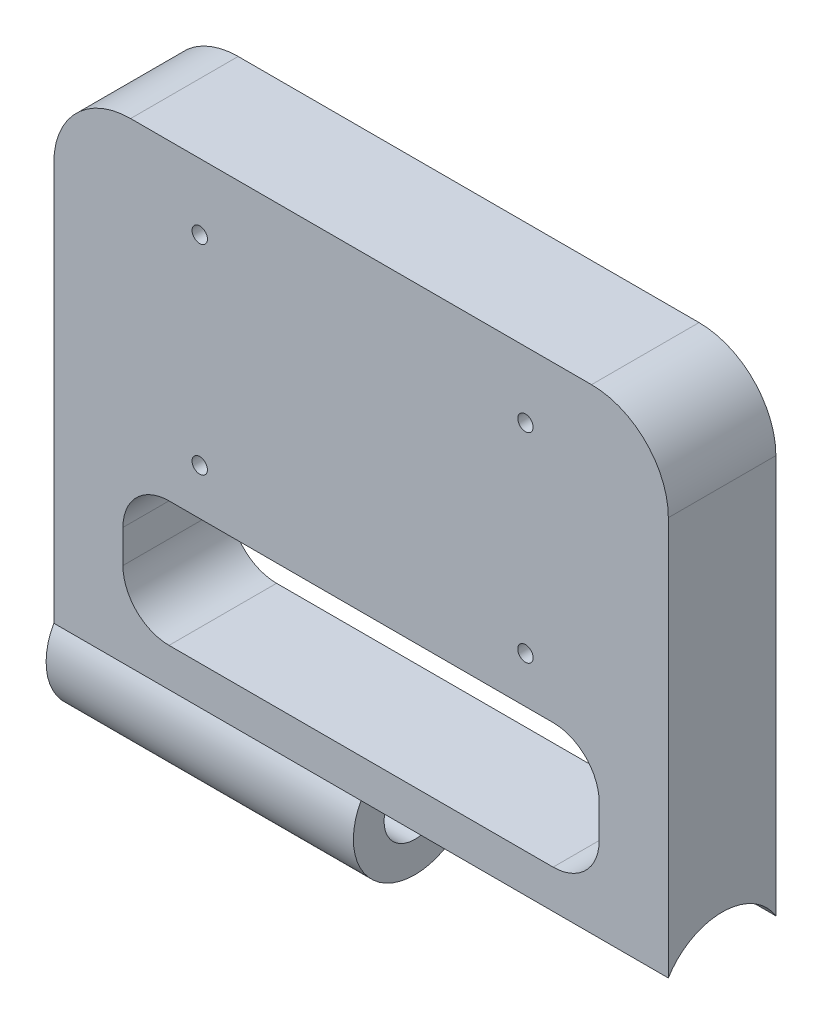
ISO-10303-21;
HEADER;
FILE_DESCRIPTION(('STEP AP214'),'2;1');
FILE_NAME('part.step','',(''),(''),'','','');
FILE_SCHEMA(('AUTOMOTIVE_DESIGN { 1 0 10303 214 1 1 1 1 }'));
ENDSEC;
DATA;
#1=APPLICATION_CONTEXT('core data for automotive mechanical design processes');
#2=APPLICATION_PROTOCOL_DEFINITION('international standard','automotive_design',2000,#1);
#3=PRODUCT_CONTEXT('',#1,'mechanical');
#4=PRODUCT('Part','Part','',(#3));
#5=PRODUCT_RELATED_PRODUCT_CATEGORY('part','',(#4));
#6=PRODUCT_DEFINITION_FORMATION('','',#4);
#7=PRODUCT_DEFINITION_CONTEXT('part definition',#1,'design');
#8=PRODUCT_DEFINITION('design','',#6,#7);
#9=PRODUCT_DEFINITION_SHAPE('','',#8);
#10=(LENGTH_UNIT() NAMED_UNIT(*) SI_UNIT(.MILLI.,.METRE.));
#11=(NAMED_UNIT(*) PLANE_ANGLE_UNIT() SI_UNIT($,.RADIAN.));
#12=(NAMED_UNIT(*) SI_UNIT($,.STERADIAN.) SOLID_ANGLE_UNIT());
#13=UNCERTAINTY_MEASURE_WITH_UNIT(LENGTH_MEASURE(1.E-05),#10,'distance_accuracy_value','');
#14=(GEOMETRIC_REPRESENTATION_CONTEXT(3) GLOBAL_UNCERTAINTY_ASSIGNED_CONTEXT((#13)) GLOBAL_UNIT_ASSIGNED_CONTEXT((#10,
#11,#12)) REPRESENTATION_CONTEXT('',''));
#15=CARTESIAN_POINT('',(0.,0.,0.));
#16=DIRECTION('',(0.,0.,1.));
#17=DIRECTION('',(1.,0.,0.));
#18=AXIS2_PLACEMENT_3D('',#15,#16,#17);
#19=CARTESIAN_POINT('',(0.,0.,7.));
#20=DIRECTION('',(0.,0.,1.));
#21=DIRECTION('',(1.,0.,0.));
#22=AXIS2_PLACEMENT_3D('',#19,#20,#21);
#23=PLANE('',#22);
#24=DIRECTION('',(0.,-1.,0.));
#25=VECTOR('',#24,1.);
#26=CARTESIAN_POINT('',(-17.7292131790809,0.,7.));
#27=LINE('',#26,#25);
#28=CARTESIAN_POINT('',(-17.7292131790809,-23.7535764306064,7.));
#29=VERTEX_POINT('',#28);
#30=CARTESIAN_POINT('',(-17.7292131790809,-25.9002044023642,7.));
#31=VERTEX_POINT('',#30);
#32=EDGE_CURVE('E239',#29,#31,#27,.T.);
#33=ORIENTED_EDGE('',*,*,#32,.F.);
#34=CARTESIAN_POINT('',(-14.7292131790809,-23.7535764306064,7.));
#35=DIRECTION('',(0.,0.,1.));
#36=DIRECTION('',(1.,0.,0.));
#37=AXIS2_PLACEMENT_3D('',#34,#35,#36);
#38=CIRCLE('',#37,3.);
#39=CARTESIAN_POINT('',(-14.7292131790809,-20.7535764306064,7.));
#40=VERTEX_POINT('',#39);
#41=EDGE_CURVE('E11',#29,#40,#38,.F.);
#42=ORIENTED_EDGE('',*,*,#41,.T.);
#43=DIRECTION('',(-1.,0.,0.));
#44=VECTOR('',#43,1.);
#45=CARTESIAN_POINT('',(0.,-20.7535764306064,7.));
#46=LINE('',#45,#44);
#47=CARTESIAN_POINT('',(10.2707868209191,-20.7535764306064,7.));
#48=VERTEX_POINT('',#47);
#49=EDGE_CURVE('E307',#48,#40,#46,.T.);
#50=ORIENTED_EDGE('',*,*,#49,.F.);
#51=CARTESIAN_POINT('',(10.2707868209191,-23.7535764306064,7.));
#52=DIRECTION('',(0.,0.,1.));
#53=DIRECTION('',(1.,0.,0.));
#54=AXIS2_PLACEMENT_3D('',#51,#52,#53);
#55=CIRCLE('',#54,3.);
#56=CARTESIAN_POINT('',(13.2707868209191,-23.7535764306064,7.));
#57=VERTEX_POINT('',#56);
#58=EDGE_CURVE('E225',#48,#57,#55,.F.);
#59=ORIENTED_EDGE('',*,*,#58,.T.);
#60=DIRECTION('',(0.,1.,0.));
#61=VECTOR('',#60,1.);
#62=CARTESIAN_POINT('',(13.2707868209191,0.,7.));
#63=LINE('',#62,#61);
#64=CARTESIAN_POINT('',(13.2707868209191,-25.9002044023642,7.));
#65=VERTEX_POINT('',#64);
#66=EDGE_CURVE('E304',#65,#57,#63,.T.);
#67=ORIENTED_EDGE('',*,*,#66,.F.);
#68=CARTESIAN_POINT('',(10.2707868209191,-25.9002044023642,7.));
#69=DIRECTION('',(0.,0.,1.));
#70=DIRECTION('',(1.,0.,0.));
#71=AXIS2_PLACEMENT_3D('',#68,#69,#70);
#72=CIRCLE('',#71,3.);
#73=CARTESIAN_POINT('',(10.2707868209191,-28.9002044023642,7.));
#74=VERTEX_POINT('',#73);
#75=EDGE_CURVE('E229',#65,#74,#72,.F.);
#76=ORIENTED_EDGE('',*,*,#75,.T.);
#77=DIRECTION('',(1.,0.,0.));
#78=VECTOR('',#77,1.);
#79=CARTESIAN_POINT('',(0.,-28.9002044023642,7.));
#80=LINE('',#79,#78);
#81=CARTESIAN_POINT('',(-14.7292131790809,-28.9002044023642,7.));
#82=VERTEX_POINT('',#81);
#83=EDGE_CURVE('E242',#82,#74,#80,.T.);
#84=ORIENTED_EDGE('',*,*,#83,.F.);
#85=CARTESIAN_POINT('',(-14.7292131790809,-25.9002044023642,7.));
#86=DIRECTION('',(0.,0.,1.));
#87=DIRECTION('',(1.,0.,0.));
#88=AXIS2_PLACEMENT_3D('',#85,#86,#87);
#89=CIRCLE('',#88,3.);
#90=EDGE_CURVE('E232',#82,#31,#89,.F.);
#91=ORIENTED_EDGE('',*,*,#90,.T.);
#92=EDGE_LOOP('',(#33,#42,#50,#59,#67,#76,#84,#91));
#93=FACE_BOUND('',#92,.T.);
#94=CARTESIAN_POINT('',(8.47078682091947,-17.7535764306064,7.));
#95=DIRECTION('',(0.,0.,1.));
#96=DIRECTION('',(1.,0.,0.));
#97=AXIS2_PLACEMENT_3D('',#94,#95,#96);
#98=CIRCLE('',#97,0.500000000000001);
#99=CARTESIAN_POINT('',(8.97078682091947,-17.7535764306064,7.));
#100=VERTEX_POINT('',#99);
#101=EDGE_CURVE('E320',#100,#100,#98,.T.);
#102=ORIENTED_EDGE('',*,*,#101,.F.);
#103=EDGE_LOOP('',(#102));
#104=FACE_BOUND('',#103,.T.);
#105=CARTESIAN_POINT('',(-12.7292131790805,-17.7535764306064,7.));
#106=DIRECTION('',(0.,0.,1.));
#107=DIRECTION('',(1.,0.,0.));
#108=AXIS2_PLACEMENT_3D('',#105,#106,#107);
#109=CIRCLE('',#108,0.500000000000001);
#110=CARTESIAN_POINT('',(-12.2292131790805,-17.7535764306064,7.));
#111=VERTEX_POINT('',#110);
#112=EDGE_CURVE('E326',#111,#111,#109,.T.);
#113=ORIENTED_EDGE('',*,*,#112,.F.);
#114=EDGE_LOOP('',(#113));
#115=FACE_BOUND('',#114,.T.);
#116=CARTESIAN_POINT('',(-12.7292131790805,-4.75357643060643,7.));
#117=DIRECTION('',(0.,0.,1.));
#118=DIRECTION('',(1.,0.,0.));
#119=AXIS2_PLACEMENT_3D('',#116,#117,#118);
#120=CIRCLE('',#119,0.500000000000001);
#121=CARTESIAN_POINT('',(-12.2292131790805,-4.75357643060643,7.));
#122=VERTEX_POINT('',#121);
#123=EDGE_CURVE('E332',#122,#122,#120,.T.);
#124=ORIENTED_EDGE('',*,*,#123,.F.);
#125=EDGE_LOOP('',(#124));
#126=FACE_BOUND('',#125,.T.);
#127=CARTESIAN_POINT('',(8.47078682091946,-4.75357643060642,7.));
#128=DIRECTION('',(0.,0.,1.));
#129=DIRECTION('',(1.,0.,0.));
#130=AXIS2_PLACEMENT_3D('',#127,#128,#129);
#131=CIRCLE('',#130,0.500000000000001);
#132=CARTESIAN_POINT('',(8.97078682091946,-4.75357643060642,7.));
#133=VERTEX_POINT('',#132);
#134=EDGE_CURVE('E338',#133,#133,#131,.T.);
#135=ORIENTED_EDGE('',*,*,#134,.F.);
#136=EDGE_LOOP('',(#135));
#137=FACE_BOUND('',#136,.T.);
#138=DIRECTION('',(-1.,0.,0.));
#139=VECTOR('',#138,1.);
#140=CARTESIAN_POINT('',(-22.2292131790809,-0.453576430606173,7.));
#141=LINE('',#140,#139);
#142=CARTESIAN_POINT('',(12.7707868209191,-0.453576430606173,7.));
#143=VERTEX_POINT('',#142);
#144=CARTESIAN_POINT('',(-17.2292131790809,-0.453576430606173,7.));
#145=VERTEX_POINT('',#144);
#146=EDGE_CURVE('E178',#143,#145,#141,.T.);
#147=ORIENTED_EDGE('',*,*,#146,.T.);
#148=CARTESIAN_POINT('',(-17.2292131790809,-5.45357643060617,7.));
#149=DIRECTION('',(0.,0.,1.));
#150=DIRECTION('',(1.,0.,0.));
#151=AXIS2_PLACEMENT_3D('',#148,#149,#150);
#152=CIRCLE('',#151,5.);
#153=CARTESIAN_POINT('',(-22.2292131790809,-5.45357643060612,7.));
#154=VERTEX_POINT('',#153);
#155=EDGE_CURVE('E200',#145,#154,#152,.T.);
#156=ORIENTED_EDGE('',*,*,#155,.T.);
#157=DIRECTION('',(0.,-1.,0.));
#158=VECTOR('',#157,1.);
#159=CARTESIAN_POINT('',(-22.2292131790809,-0.453576430606173,7.));
#160=LINE('',#159,#158);
#161=CARTESIAN_POINT('',(-22.2292131790812,-31.400204402364,7.));
#162=VERTEX_POINT('',#161);
#163=EDGE_CURVE('E351',#154,#162,#160,.T.);
#164=ORIENTED_EDGE('',*,*,#163,.T.);
#165=DIRECTION('',(-1.,0.,0.));
#166=VECTOR('',#165,1.);
#167=CARTESIAN_POINT('',(-2.22921317908087,-31.400204402364,7.));
#168=LINE('',#167,#166);
#169=CARTESIAN_POINT('',(-2.22921317908087,-31.4002044023644,7.));
#170=VERTEX_POINT('',#169);
#171=EDGE_CURVE('E155',#162,#170,#168,.F.);
#172=ORIENTED_EDGE('',*,*,#171,.T.);
#173=DIRECTION('',(1.,0.,0.));
#174=VECTOR('',#173,1.);
#175=CARTESIAN_POINT('',(-2.22921317908087,-31.4002044023644,7.));
#176=LINE('',#175,#174);
#177=CARTESIAN_POINT('',(17.7707868209191,-31.4002044023644,7.));
#178=VERTEX_POINT('',#177);
#179=EDGE_CURVE('E170',#178,#170,#176,.F.);
#180=ORIENTED_EDGE('',*,*,#179,.F.);
#181=DIRECTION('',(0.,1.,0.));
#182=VECTOR('',#181,1.);
#183=CARTESIAN_POINT('',(17.7707868209191,-0.453576430606173,7.));
#184=LINE('',#183,#182);
#185=CARTESIAN_POINT('',(17.7707868209191,-5.45357643060623,7.));
#186=VERTEX_POINT('',#185);
#187=EDGE_CURVE('E184',#178,#186,#184,.T.);
#188=ORIENTED_EDGE('',*,*,#187,.T.);
#189=CARTESIAN_POINT('',(12.7707868209191,-5.45357643060617,7.));
#190=DIRECTION('',(0.,0.,1.));
#191=DIRECTION('',(1.,0.,0.));
#192=AXIS2_PLACEMENT_3D('',#189,#190,#191);
#193=CIRCLE('',#192,5.);
#194=EDGE_CURVE('E198',#186,#143,#193,.T.);
#195=ORIENTED_EDGE('',*,*,#194,.T.);
#196=EDGE_LOOP('',(#147,#156,#164,#172,#180,#188,#195));
#197=FACE_BOUND('',#196,.T.);
#198=ADVANCED_FACE('F37',(#93,#104,#115,#126,#137,#197),#23,.T.);
#199=CARTESIAN_POINT('',(0.,0.,0.));
#200=DIRECTION('',(0.,0.,1.));
#201=DIRECTION('',(1.,0.,0.));
#202=AXIS2_PLACEMENT_3D('',#199,#200,#201);
#203=PLANE('',#202);
#204=DIRECTION('',(1.,0.,0.));
#205=VECTOR('',#204,1.);
#206=CARTESIAN_POINT('',(-17.7292131790809,-20.7535764306064,0.));
#207=LINE('',#206,#205);
#208=CARTESIAN_POINT('',(-14.7292131790809,-20.7535764306064,0.));
#209=VERTEX_POINT('',#208);
#210=CARTESIAN_POINT('',(10.2707868209191,-20.7535764306064,0.));
#211=VERTEX_POINT('',#210);
#212=EDGE_CURVE('E411',#209,#211,#207,.T.);
#213=ORIENTED_EDGE('',*,*,#212,.F.);
#214=CARTESIAN_POINT('',(-14.7292131790809,-23.7535764306064,0.));
#215=DIRECTION('',(0.,0.,1.));
#216=DIRECTION('',(1.,0.,0.));
#217=AXIS2_PLACEMENT_3D('',#214,#215,#216);
#218=CIRCLE('',#217,3.);
#219=CARTESIAN_POINT('',(-17.7292131790809,-23.7535764306064,0.));
#220=VERTEX_POINT('',#219);
#221=EDGE_CURVE('E45',#209,#220,#218,.T.);
#222=ORIENTED_EDGE('',*,*,#221,.T.);
#223=DIRECTION('',(0.,1.,0.));
#224=VECTOR('',#223,1.);
#225=CARTESIAN_POINT('',(-17.7292131790809,-20.7535764306064,0.));
#226=LINE('',#225,#224);
#227=CARTESIAN_POINT('',(-17.7292131790809,-25.9002044023642,0.));
#228=VERTEX_POINT('',#227);
#229=EDGE_CURVE('E414',#228,#220,#226,.T.);
#230=ORIENTED_EDGE('',*,*,#229,.F.);
#231=CARTESIAN_POINT('',(-14.7292131790809,-25.9002044023642,0.));
#232=DIRECTION('',(0.,0.,1.));
#233=DIRECTION('',(1.,0.,0.));
#234=AXIS2_PLACEMENT_3D('',#231,#232,#233);
#235=CIRCLE('',#234,3.);
#236=CARTESIAN_POINT('',(-14.7292131790809,-28.9002044023642,0.));
#237=VERTEX_POINT('',#236);
#238=EDGE_CURVE('E59',#228,#237,#235,.T.);
#239=ORIENTED_EDGE('',*,*,#238,.T.);
#240=DIRECTION('',(-1.,0.,0.));
#241=VECTOR('',#240,1.);
#242=CARTESIAN_POINT('',(-17.7292131790809,-28.9002044023642,0.));
#243=LINE('',#242,#241);
#244=CARTESIAN_POINT('',(10.2707868209191,-28.9002044023642,0.));
#245=VERTEX_POINT('',#244);
#246=EDGE_CURVE('E314',#245,#237,#243,.T.);
#247=ORIENTED_EDGE('',*,*,#246,.F.);
#248=CARTESIAN_POINT('',(10.2707868209191,-25.9002044023642,0.));
#249=DIRECTION('',(0.,0.,1.));
#250=DIRECTION('',(1.,0.,0.));
#251=AXIS2_PLACEMENT_3D('',#248,#249,#250);
#252=CIRCLE('',#251,3.);
#253=CARTESIAN_POINT('',(13.2707868209191,-25.9002044023642,0.));
#254=VERTEX_POINT('',#253);
#255=EDGE_CURVE('E227',#245,#254,#252,.T.);
#256=ORIENTED_EDGE('',*,*,#255,.T.);
#257=DIRECTION('',(0.,-1.,0.));
#258=VECTOR('',#257,1.);
#259=CARTESIAN_POINT('',(13.2707868209191,-20.7535764306064,0.));
#260=LINE('',#259,#258);
#261=CARTESIAN_POINT('',(13.2707868209191,-23.7535764306064,0.));
#262=VERTEX_POINT('',#261);
#263=EDGE_CURVE('E410',#262,#254,#260,.T.);
#264=ORIENTED_EDGE('',*,*,#263,.F.);
#265=CARTESIAN_POINT('',(10.2707868209191,-23.7535764306064,0.));
#266=DIRECTION('',(0.,0.,1.));
#267=DIRECTION('',(1.,0.,0.));
#268=AXIS2_PLACEMENT_3D('',#265,#266,#267);
#269=CIRCLE('',#268,3.);
#270=EDGE_CURVE('E223',#262,#211,#269,.T.);
#271=ORIENTED_EDGE('',*,*,#270,.T.);
#272=EDGE_LOOP('',(#213,#222,#230,#239,#247,#256,#264,#271));
#273=FACE_BOUND('',#272,.T.);
#274=CARTESIAN_POINT('',(8.47078682091947,-17.7535764306064,0.));
#275=DIRECTION('',(0.,0.,-1.));
#276=DIRECTION('',(-1.,0.,0.));
#277=AXIS2_PLACEMENT_3D('',#274,#275,#276);
#278=CIRCLE('',#277,0.500000000000001);
#279=CARTESIAN_POINT('',(7.97078682091947,-17.7535764306064,0.));
#280=VERTEX_POINT('',#279);
#281=EDGE_CURVE('E246',#280,#280,#278,.T.);
#282=ORIENTED_EDGE('',*,*,#281,.F.);
#283=EDGE_LOOP('',(#282));
#284=FACE_BOUND('',#283,.T.);
#285=CARTESIAN_POINT('',(-12.7292131790805,-17.7535764306064,0.));
#286=DIRECTION('',(0.,0.,-1.));
#287=DIRECTION('',(-1.,0.,0.));
#288=AXIS2_PLACEMENT_3D('',#285,#286,#287);
#289=CIRCLE('',#288,0.500000000000001);
#290=CARTESIAN_POINT('',(-13.2292131790805,-17.7535764306064,0.));
#291=VERTEX_POINT('',#290);
#292=EDGE_CURVE('E323',#291,#291,#289,.T.);
#293=ORIENTED_EDGE('',*,*,#292,.F.);
#294=EDGE_LOOP('',(#293));
#295=FACE_BOUND('',#294,.T.);
#296=CARTESIAN_POINT('',(-12.7292131790805,-4.75357643060643,0.));
#297=DIRECTION('',(0.,0.,-1.));
#298=DIRECTION('',(-1.,0.,0.));
#299=AXIS2_PLACEMENT_3D('',#296,#297,#298);
#300=CIRCLE('',#299,0.500000000000001);
#301=CARTESIAN_POINT('',(-13.2292131790805,-4.75357643060643,0.));
#302=VERTEX_POINT('',#301);
#303=EDGE_CURVE('E329',#302,#302,#300,.T.);
#304=ORIENTED_EDGE('',*,*,#303,.F.);
#305=EDGE_LOOP('',(#304));
#306=FACE_BOUND('',#305,.T.);
#307=CARTESIAN_POINT('',(8.47078682091946,-4.75357643060642,0.));
#308=DIRECTION('',(0.,0.,-1.));
#309=DIRECTION('',(-1.,0.,0.));
#310=AXIS2_PLACEMENT_3D('',#307,#308,#309);
#311=CIRCLE('',#310,0.500000000000001);
#312=CARTESIAN_POINT('',(7.97078682091946,-4.75357643060642,0.));
#313=VERTEX_POINT('',#312);
#314=EDGE_CURVE('E335',#313,#313,#311,.T.);
#315=ORIENTED_EDGE('',*,*,#314,.F.);
#316=EDGE_LOOP('',(#315));
#317=FACE_BOUND('',#316,.T.);
#318=DIRECTION('',(0.,-1.,0.));
#319=VECTOR('',#318,1.);
#320=CARTESIAN_POINT('',(-22.2292131790809,-0.453576430606173,0.));
#321=LINE('',#320,#319);
#322=CARTESIAN_POINT('',(-22.2292131790809,-5.45357643060612,0.));
#323=VERTEX_POINT('',#322);
#324=CARTESIAN_POINT('',(-22.2292131790809,-31.400204402364,0.));
#325=VERTEX_POINT('',#324);
#326=EDGE_CURVE('E350',#323,#325,#321,.T.);
#327=ORIENTED_EDGE('',*,*,#326,.F.);
#328=CARTESIAN_POINT('',(-17.2292131790809,-5.45357643060617,0.));
#329=DIRECTION('',(0.,0.,1.));
#330=DIRECTION('',(1.,0.,0.));
#331=AXIS2_PLACEMENT_3D('',#328,#329,#330);
#332=CIRCLE('',#331,5.);
#333=CARTESIAN_POINT('',(-17.2292131790809,-0.453576430606173,0.));
#334=VERTEX_POINT('',#333);
#335=EDGE_CURVE('E191',#323,#334,#332,.F.);
#336=ORIENTED_EDGE('',*,*,#335,.T.);
#337=DIRECTION('',(-1.,0.,0.));
#338=VECTOR('',#337,1.);
#339=CARTESIAN_POINT('',(-22.2292131790809,-0.453576430606173,0.));
#340=LINE('',#339,#338);
#341=CARTESIAN_POINT('',(12.7707868209191,-0.453576430606173,0.));
#342=VERTEX_POINT('',#341);
#343=EDGE_CURVE('E187',#342,#334,#340,.T.);
#344=ORIENTED_EDGE('',*,*,#343,.F.);
#345=CARTESIAN_POINT('',(12.7707868209191,-5.45357643060617,0.));
#346=DIRECTION('',(0.,0.,1.));
#347=DIRECTION('',(1.,0.,0.));
#348=AXIS2_PLACEMENT_3D('',#345,#346,#347);
#349=CIRCLE('',#348,5.);
#350=CARTESIAN_POINT('',(17.7707868209191,-5.45357643060623,0.));
#351=VERTEX_POINT('',#350);
#352=EDGE_CURVE('E181',#342,#351,#349,.F.);
#353=ORIENTED_EDGE('',*,*,#352,.T.);
#354=DIRECTION('',(0.,1.,0.));
#355=VECTOR('',#354,1.);
#356=CARTESIAN_POINT('',(17.7707868209191,-0.453576430606173,0.));
#357=LINE('',#356,#355);
#358=CARTESIAN_POINT('',(17.7707868209191,-31.4002044023644,0.));
#359=VERTEX_POINT('',#358);
#360=EDGE_CURVE('E176',#359,#351,#357,.T.);
#361=ORIENTED_EDGE('',*,*,#360,.F.);
#362=DIRECTION('',(1.,0.,0.));
#363=VECTOR('',#362,1.);
#364=CARTESIAN_POINT('',(-2.22921317908087,-31.4002044023644,0.));
#365=LINE('',#364,#363);
#366=CARTESIAN_POINT('',(-2.22921317908087,-31.400204402364,0.));
#367=VERTEX_POINT('',#366);
#368=EDGE_CURVE('E167',#359,#367,#365,.F.);
#369=ORIENTED_EDGE('',*,*,#368,.T.);
#370=DIRECTION('',(-1.,0.,0.));
#371=VECTOR('',#370,1.);
#372=CARTESIAN_POINT('',(-2.22921317908087,-31.400204402364,0.));
#373=LINE('',#372,#371);
#374=EDGE_CURVE('E145',#325,#367,#373,.F.);
#375=ORIENTED_EDGE('',*,*,#374,.F.);
#376=EDGE_LOOP('',(#327,#336,#344,#353,#361,#369,#375));
#377=FACE_BOUND('',#376,.T.);
#378=ADVANCED_FACE('F174',(#273,#284,#295,#306,#317,#377),#203,.F.);
#379=CARTESIAN_POINT('',(-22.2292131790809,-0.453576430606173,7.));
#380=DIRECTION('',(1.,0.,0.));
#381=DIRECTION('',(0.,1.,0.));
#382=AXIS2_PLACEMENT_3D('',#379,#380,#381);
#383=PLANE('',#382);
#384=CARTESIAN_POINT('',(-22.2292131790809,-33.3366960754678,3.5));
#385=DIRECTION('',(1.,0.,0.));
#386=DIRECTION('',(0.,1.,0.));
#387=AXIS2_PLACEMENT_3D('',#384,#385,#386);
#388=CIRCLE('',#387,2.);
#389=CARTESIAN_POINT('',(-22.2292131790809,-31.3366960754678,3.5));
#390=VERTEX_POINT('',#389);
#391=EDGE_CURVE('E341',#390,#390,#388,.T.);
#392=ORIENTED_EDGE('',*,*,#391,.T.);
#393=EDGE_LOOP('',(#392));
#394=FACE_BOUND('',#393,.T.);
#395=ORIENTED_EDGE('',*,*,#163,.F.);
#396=DIRECTION('',(0.,0.,-1.));
#397=VECTOR('',#396,1.);
#398=CARTESIAN_POINT('',(-22.2292131790809,-5.45357643060612,7.));
#399=LINE('',#398,#397);
#400=EDGE_CURVE('E177',#154,#323,#399,.T.);
#401=ORIENTED_EDGE('',*,*,#400,.T.);
#402=ORIENTED_EDGE('',*,*,#326,.T.);
#403=CARTESIAN_POINT('',(-22.2292131790809,-33.3366960754678,3.5));
#404=DIRECTION('',(1.,0.,0.));
#405=DIRECTION('',(0.,1.,0.));
#406=AXIS2_PLACEMENT_3D('',#403,#404,#405);
#407=CIRCLE('',#406,4.);
#408=EDGE_CURVE('E151',#162,#325,#407,.T.);
#409=ORIENTED_EDGE('',*,*,#408,.F.);
#410=EDGE_LOOP('',(#395,#401,#402,#409));
#411=FACE_BOUND('',#410,.T.);
#412=ADVANCED_FACE('F264',(#394,#411),#383,.F.);
#413=CARTESIAN_POINT('',(17.7707868209191,-0.453576430606173,7.));
#414=DIRECTION('',(-1.,0.,0.));
#415=DIRECTION('',(0.,-1.,0.));
#416=AXIS2_PLACEMENT_3D('',#413,#414,#415);
#417=PLANE('',#416);
#418=ORIENTED_EDGE('',*,*,#360,.T.);
#419=DIRECTION('',(0.,0.,-1.));
#420=VECTOR('',#419,1.);
#421=CARTESIAN_POINT('',(17.7707868209191,-5.45357643060623,7.));
#422=LINE('',#421,#420);
#423=EDGE_CURVE('E202',#351,#186,#422,.F.);
#424=ORIENTED_EDGE('',*,*,#423,.T.);
#425=ORIENTED_EDGE('',*,*,#187,.F.);
#426=CARTESIAN_POINT('',(17.7707868209191,-33.5356200527707,3.5));
#427=DIRECTION('',(1.,0.,0.));
#428=DIRECTION('',(0.,1.,0.));
#429=AXIS2_PLACEMENT_3D('',#426,#427,#428);
#430=CIRCLE('',#429,4.1);
#431=EDGE_CURVE('E171',#359,#178,#430,.T.);
#432=ORIENTED_EDGE('',*,*,#431,.F.);
#433=EDGE_LOOP('',(#418,#424,#425,#432));
#434=FACE_BOUND('',#433,.T.);
#435=ADVANCED_FACE('F272',(#434),#417,.F.);
#436=CARTESIAN_POINT('',(-22.2292131790809,-0.453576430606173,7.));
#437=DIRECTION('',(0.,-1.,0.));
#438=DIRECTION('',(0.,0.,-1.));
#439=AXIS2_PLACEMENT_3D('',#436,#437,#438);
#440=PLANE('',#439);
#441=ORIENTED_EDGE('',*,*,#343,.T.);
#442=DIRECTION('',(0.,0.,-1.));
#443=VECTOR('',#442,1.);
#444=CARTESIAN_POINT('',(-17.2292131790809,-0.453576430606173,7.));
#445=LINE('',#444,#443);
#446=EDGE_CURVE('E196',#334,#145,#445,.F.);
#447=ORIENTED_EDGE('',*,*,#446,.T.);
#448=ORIENTED_EDGE('',*,*,#146,.F.);
#449=DIRECTION('',(0.,0.,-1.));
#450=VECTOR('',#449,1.);
#451=CARTESIAN_POINT('',(12.7707868209191,-0.453576430606173,7.));
#452=LINE('',#451,#450);
#453=EDGE_CURVE('E193',#143,#342,#452,.T.);
#454=ORIENTED_EDGE('',*,*,#453,.T.);
#455=EDGE_LOOP('',(#441,#447,#448,#454));
#456=FACE_BOUND('',#455,.T.);
#457=ADVANCED_FACE('F269',(#456),#440,.F.);
#458=CARTESIAN_POINT('',(-2.22921317908087,-33.5356200527707,3.5));
#459=DIRECTION('',(1.,0.,0.));
#460=DIRECTION('',(0.,1.,0.));
#461=AXIS2_PLACEMENT_3D('',#458,#459,#460);
#462=CYLINDRICAL_SURFACE('',#461,4.1);
#463=ORIENTED_EDGE('',*,*,#179,.T.);
#464=CARTESIAN_POINT('',(-2.22921317908087,-33.5356200527707,3.5));
#465=DIRECTION('',(1.,0.,0.));
#466=DIRECTION('',(0.,1.,0.));
#467=AXIS2_PLACEMENT_3D('',#464,#465,#466);
#468=CIRCLE('',#467,4.1);
#469=EDGE_CURVE('E161',#367,#170,#468,.T.);
#470=ORIENTED_EDGE('',*,*,#469,.F.);
#471=ORIENTED_EDGE('',*,*,#368,.F.);
#472=ORIENTED_EDGE('',*,*,#431,.T.);
#473=EDGE_LOOP('',(#463,#470,#471,#472));
#474=FACE_BOUND('',#473,.T.);
#475=ADVANCED_FACE('F166',(#474),#462,.F.);
#476=CARTESIAN_POINT('',(-2.22921317908087,-33.5356200527707,3.5));
#477=DIRECTION('',(1.,0.,0.));
#478=DIRECTION('',(0.,1.,0.));
#479=AXIS2_PLACEMENT_3D('',#476,#477,#478);
#480=PLANE('',#479);
#481=CARTESIAN_POINT('',(-2.22921317908087,-33.3366960754678,3.5));
#482=DIRECTION('',(1.,0.,0.));
#483=DIRECTION('',(0.,1.,0.));
#484=AXIS2_PLACEMENT_3D('',#481,#482,#483);
#485=CIRCLE('',#484,2.);
#486=CARTESIAN_POINT('',(-2.22921317908087,-31.3366960754678,3.5));
#487=VERTEX_POINT('',#486);
#488=EDGE_CURVE('E162',#487,#487,#485,.T.);
#489=ORIENTED_EDGE('',*,*,#488,.F.);
#490=EDGE_LOOP('',(#489));
#491=FACE_BOUND('',#490,.T.);
#492=ORIENTED_EDGE('',*,*,#469,.T.);
#493=CARTESIAN_POINT('',(-2.22921317908087,-33.3366960754678,3.5));
#494=DIRECTION('',(1.,0.,0.));
#495=DIRECTION('',(0.,1.,0.));
#496=AXIS2_PLACEMENT_3D('',#493,#494,#495);
#497=CIRCLE('',#496,4.);
#498=EDGE_CURVE('E149',#170,#367,#497,.T.);
#499=ORIENTED_EDGE('',*,*,#498,.T.);
#500=EDGE_LOOP('',(#492,#499));
#501=FACE_BOUND('',#500,.T.);
#502=ADVANCED_FACE('F160',(#491,#501),#480,.T.);
#503=CARTESIAN_POINT('',(-2.22921317908087,-33.3366960754678,3.5));
#504=DIRECTION('',(-1.,0.,0.));
#505=DIRECTION('',(0.,-1.,0.));
#506=AXIS2_PLACEMENT_3D('',#503,#504,#505);
#507=CYLINDRICAL_SURFACE('',#506,2.);
#508=ORIENTED_EDGE('',*,*,#488,.T.);
#509=EDGE_LOOP('',(#508));
#510=FACE_BOUND('',#509,.T.);
#511=ORIENTED_EDGE('',*,*,#391,.F.);
#512=EDGE_LOOP('',(#511));
#513=FACE_BOUND('',#512,.T.);
#514=ADVANCED_FACE('F370',(#510,#513),#507,.F.);
#515=CARTESIAN_POINT('',(-2.22921317908087,-33.3366960754678,3.5));
#516=DIRECTION('',(-1.,0.,0.));
#517=DIRECTION('',(0.,-1.,0.));
#518=AXIS2_PLACEMENT_3D('',#515,#516,#517);
#519=CYLINDRICAL_SURFACE('',#518,4.);
#520=ORIENTED_EDGE('',*,*,#171,.F.);
#521=ORIENTED_EDGE('',*,*,#408,.T.);
#522=ORIENTED_EDGE('',*,*,#374,.T.);
#523=ORIENTED_EDGE('',*,*,#498,.F.);
#524=EDGE_LOOP('',(#520,#521,#522,#523));
#525=FACE_BOUND('',#524,.T.);
#526=ADVANCED_FACE('F148',(#525),#519,.T.);
#527=CARTESIAN_POINT('',(-17.2292131790809,-5.45357643060617,7.));
#528=DIRECTION('',(0.,0.,-1.));
#529=DIRECTION('',(-1.,0.,0.));
#530=AXIS2_PLACEMENT_3D('',#527,#528,#529);
#531=CYLINDRICAL_SURFACE('',#530,5.);
#532=ORIENTED_EDGE('',*,*,#155,.F.);
#533=ORIENTED_EDGE('',*,*,#446,.F.);
#534=ORIENTED_EDGE('',*,*,#335,.F.);
#535=ORIENTED_EDGE('',*,*,#400,.F.);
#536=EDGE_LOOP('',(#532,#533,#534,#535));
#537=FACE_BOUND('',#536,.T.);
#538=ADVANCED_FACE('F280',(#537),#531,.T.);
#539=CARTESIAN_POINT('',(12.7707868209191,-5.45357643060617,7.));
#540=DIRECTION('',(0.,0.,-1.));
#541=DIRECTION('',(-1.,0.,0.));
#542=AXIS2_PLACEMENT_3D('',#539,#540,#541);
#543=CYLINDRICAL_SURFACE('',#542,5.);
#544=ORIENTED_EDGE('',*,*,#194,.F.);
#545=ORIENTED_EDGE('',*,*,#423,.F.);
#546=ORIENTED_EDGE('',*,*,#352,.F.);
#547=ORIENTED_EDGE('',*,*,#453,.F.);
#548=EDGE_LOOP('',(#544,#545,#546,#547));
#549=FACE_BOUND('',#548,.T.);
#550=ADVANCED_FACE('F283',(#549),#543,.T.);
#551=CARTESIAN_POINT('',(8.47078682091946,-4.75357643060642,7.5));
#552=DIRECTION('',(0.,0.,-1.));
#553=DIRECTION('',(-1.,0.,0.));
#554=AXIS2_PLACEMENT_3D('',#551,#552,#553);
#555=CYLINDRICAL_SURFACE('',#554,0.500000000000001);
#556=ORIENTED_EDGE('',*,*,#134,.T.);
#557=EDGE_LOOP('',(#556));
#558=FACE_BOUND('',#557,.T.);
#559=ORIENTED_EDGE('',*,*,#314,.T.);
#560=EDGE_LOOP('',(#559));
#561=FACE_BOUND('',#560,.T.);
#562=ADVANCED_FACE('F287',(#558,#561),#555,.F.);
#563=CARTESIAN_POINT('',(-12.7292131790805,-4.75357643060643,7.5));
#564=DIRECTION('',(0.,0.,-1.));
#565=DIRECTION('',(-1.,0.,0.));
#566=AXIS2_PLACEMENT_3D('',#563,#564,#565);
#567=CYLINDRICAL_SURFACE('',#566,0.500000000000001);
#568=ORIENTED_EDGE('',*,*,#123,.T.);
#569=EDGE_LOOP('',(#568));
#570=FACE_BOUND('',#569,.T.);
#571=ORIENTED_EDGE('',*,*,#303,.T.);
#572=EDGE_LOOP('',(#571));
#573=FACE_BOUND('',#572,.T.);
#574=ADVANCED_FACE('F384',(#570,#573),#567,.F.);
#575=CARTESIAN_POINT('',(-12.7292131790805,-17.7535764306064,7.5));
#576=DIRECTION('',(0.,0.,-1.));
#577=DIRECTION('',(-1.,0.,0.));
#578=AXIS2_PLACEMENT_3D('',#575,#576,#577);
#579=CYLINDRICAL_SURFACE('',#578,0.500000000000001);
#580=ORIENTED_EDGE('',*,*,#112,.T.);
#581=EDGE_LOOP('',(#580));
#582=FACE_BOUND('',#581,.T.);
#583=ORIENTED_EDGE('',*,*,#292,.T.);
#584=EDGE_LOOP('',(#583));
#585=FACE_BOUND('',#584,.T.);
#586=ADVANCED_FACE('F388',(#582,#585),#579,.F.);
#587=CARTESIAN_POINT('',(8.47078682091947,-17.7535764306064,7.5));
#588=DIRECTION('',(0.,0.,-1.));
#589=DIRECTION('',(-1.,0.,0.));
#590=AXIS2_PLACEMENT_3D('',#587,#588,#589);
#591=CYLINDRICAL_SURFACE('',#590,0.500000000000001);
#592=ORIENTED_EDGE('',*,*,#101,.T.);
#593=EDGE_LOOP('',(#592));
#594=FACE_BOUND('',#593,.T.);
#595=ORIENTED_EDGE('',*,*,#281,.T.);
#596=EDGE_LOOP('',(#595));
#597=FACE_BOUND('',#596,.T.);
#598=ADVANCED_FACE('F392',(#594,#597),#591,.F.);
#599=CARTESIAN_POINT('',(-17.7292131790809,-20.7535764306064,7.5));
#600=DIRECTION('',(-1.,0.,0.));
#601=DIRECTION('',(0.,0.,1.));
#602=AXIS2_PLACEMENT_3D('',#599,#600,#601);
#603=PLANE('',#602);
#604=ORIENTED_EDGE('',*,*,#32,.T.);
#605=DIRECTION('',(0.,0.,-1.));
#606=VECTOR('',#605,1.);
#607=CARTESIAN_POINT('',(-17.7292131790809,-25.9002044023642,0.));
#608=LINE('',#607,#606);
#609=EDGE_CURVE('E221',#31,#228,#608,.T.);
#610=ORIENTED_EDGE('',*,*,#609,.T.);
#611=ORIENTED_EDGE('',*,*,#229,.T.);
#612=DIRECTION('',(0.,0.,-1.));
#613=VECTOR('',#612,1.);
#614=CARTESIAN_POINT('',(-17.7292131790809,-23.7535764306064,7.));
#615=LINE('',#614,#613);
#616=EDGE_CURVE('E219',#220,#29,#615,.F.);
#617=ORIENTED_EDGE('',*,*,#616,.T.);
#618=EDGE_LOOP('',(#604,#610,#611,#617));
#619=FACE_BOUND('',#618,.T.);
#620=ADVANCED_FACE('F244',(#619),#603,.F.);
#621=CARTESIAN_POINT('',(-17.7292131790809,-28.9002044023642,7.5));
#622=DIRECTION('',(0.,-1.,0.));
#623=DIRECTION('',(1.,0.,0.));
#624=AXIS2_PLACEMENT_3D('',#621,#622,#623);
#625=PLANE('',#624);
#626=ORIENTED_EDGE('',*,*,#83,.T.);
#627=DIRECTION('',(0.,0.,-1.));
#628=VECTOR('',#627,1.);
#629=CARTESIAN_POINT('',(10.2707868209191,-28.9002044023642,0.));
#630=LINE('',#629,#628);
#631=EDGE_CURVE('E216',#74,#245,#630,.T.);
#632=ORIENTED_EDGE('',*,*,#631,.T.);
#633=ORIENTED_EDGE('',*,*,#246,.T.);
#634=DIRECTION('',(0.,0.,-1.));
#635=VECTOR('',#634,1.);
#636=CARTESIAN_POINT('',(-14.7292131790809,-28.9002044023642,7.));
#637=LINE('',#636,#635);
#638=EDGE_CURVE('E214',#237,#82,#637,.F.);
#639=ORIENTED_EDGE('',*,*,#638,.T.);
#640=EDGE_LOOP('',(#626,#632,#633,#639));
#641=FACE_BOUND('',#640,.T.);
#642=ADVANCED_FACE('F398',(#641),#625,.F.);
#643=CARTESIAN_POINT('',(13.2707868209191,-20.7535764306064,7.5));
#644=DIRECTION('',(1.,0.,0.));
#645=DIRECTION('',(0.,1.,0.));
#646=AXIS2_PLACEMENT_3D('',#643,#644,#645);
#647=PLANE('',#646);
#648=ORIENTED_EDGE('',*,*,#66,.T.);
#649=DIRECTION('',(0.,0.,-1.));
#650=VECTOR('',#649,1.);
#651=CARTESIAN_POINT('',(13.2707868209191,-23.7535764306064,0.));
#652=LINE('',#651,#650);
#653=EDGE_CURVE('E206',#57,#262,#652,.T.);
#654=ORIENTED_EDGE('',*,*,#653,.T.);
#655=ORIENTED_EDGE('',*,*,#263,.T.);
#656=DIRECTION('',(0.,0.,-1.));
#657=VECTOR('',#656,1.);
#658=CARTESIAN_POINT('',(13.2707868209191,-25.9002044023642,7.));
#659=LINE('',#658,#657);
#660=EDGE_CURVE('E204',#254,#65,#659,.F.);
#661=ORIENTED_EDGE('',*,*,#660,.T.);
#662=EDGE_LOOP('',(#648,#654,#655,#661));
#663=FACE_BOUND('',#662,.T.);
#664=ADVANCED_FACE('F295',(#663),#647,.F.);
#665=CARTESIAN_POINT('',(-17.7292131790809,-20.7535764306064,7.5));
#666=DIRECTION('',(0.,1.,0.));
#667=DIRECTION('',(-1.,0.,0.));
#668=AXIS2_PLACEMENT_3D('',#665,#666,#667);
#669=PLANE('',#668);
#670=ORIENTED_EDGE('',*,*,#212,.T.);
#671=DIRECTION('',(0.,0.,-1.));
#672=VECTOR('',#671,1.);
#673=CARTESIAN_POINT('',(10.2707868209191,-20.7535764306064,7.));
#674=LINE('',#673,#672);
#675=EDGE_CURVE('E212',#211,#48,#674,.F.);
#676=ORIENTED_EDGE('',*,*,#675,.T.);
#677=ORIENTED_EDGE('',*,*,#49,.T.);
#678=DIRECTION('',(0.,0.,-1.));
#679=VECTOR('',#678,1.);
#680=CARTESIAN_POINT('',(-14.7292131790809,-20.7535764306064,0.));
#681=LINE('',#680,#679);
#682=EDGE_CURVE('E209',#40,#209,#681,.T.);
#683=ORIENTED_EDGE('',*,*,#682,.T.);
#684=EDGE_LOOP('',(#670,#676,#677,#683));
#685=FACE_BOUND('',#684,.T.);
#686=ADVANCED_FACE('F290',(#685),#669,.F.);
#687=CARTESIAN_POINT('',(10.2707868209191,-23.7535764306064,7.5));
#688=DIRECTION('',(0.,0.,1.));
#689=DIRECTION('',(1.,0.,0.));
#690=AXIS2_PLACEMENT_3D('',#687,#688,#689);
#691=CYLINDRICAL_SURFACE('',#690,3.);
#692=ORIENTED_EDGE('',*,*,#58,.F.);
#693=ORIENTED_EDGE('',*,*,#675,.F.);
#694=ORIENTED_EDGE('',*,*,#270,.F.);
#695=ORIENTED_EDGE('',*,*,#653,.F.);
#696=EDGE_LOOP('',(#692,#693,#694,#695));
#697=FACE_BOUND('',#696,.T.);
#698=ADVANCED_FACE('F256',(#697),#691,.F.);
#699=CARTESIAN_POINT('',(10.2707868209191,-25.9002044023642,7.5));
#700=DIRECTION('',(0.,0.,1.));
#701=DIRECTION('',(1.,0.,0.));
#702=AXIS2_PLACEMENT_3D('',#699,#700,#701);
#703=CYLINDRICAL_SURFACE('',#702,3.);
#704=ORIENTED_EDGE('',*,*,#75,.F.);
#705=ORIENTED_EDGE('',*,*,#660,.F.);
#706=ORIENTED_EDGE('',*,*,#255,.F.);
#707=ORIENTED_EDGE('',*,*,#631,.F.);
#708=EDGE_LOOP('',(#704,#705,#706,#707));
#709=FACE_BOUND('',#708,.T.);
#710=ADVANCED_FACE('F250',(#709),#703,.F.);
#711=CARTESIAN_POINT('',(-14.7292131790809,-25.9002044023642,7.5));
#712=DIRECTION('',(0.,0.,1.));
#713=DIRECTION('',(1.,0.,0.));
#714=AXIS2_PLACEMENT_3D('',#711,#712,#713);
#715=CYLINDRICAL_SURFACE('',#714,3.);
#716=ORIENTED_EDGE('',*,*,#90,.F.);
#717=ORIENTED_EDGE('',*,*,#638,.F.);
#718=ORIENTED_EDGE('',*,*,#238,.F.);
#719=ORIENTED_EDGE('',*,*,#609,.F.);
#720=EDGE_LOOP('',(#716,#717,#718,#719));
#721=FACE_BOUND('',#720,.T.);
#722=ADVANCED_FACE('F248',(#721),#715,.F.);
#723=CARTESIAN_POINT('',(-14.7292131790809,-23.7535764306064,7.5));
#724=DIRECTION('',(0.,0.,1.));
#725=DIRECTION('',(1.,0.,0.));
#726=AXIS2_PLACEMENT_3D('',#723,#724,#725);
#727=CYLINDRICAL_SURFACE('',#726,3.);
#728=ORIENTED_EDGE('',*,*,#41,.F.);
#729=ORIENTED_EDGE('',*,*,#616,.F.);
#730=ORIENTED_EDGE('',*,*,#221,.F.);
#731=ORIENTED_EDGE('',*,*,#682,.F.);
#732=EDGE_LOOP('',(#728,#729,#730,#731));
#733=FACE_BOUND('',#732,.T.);
#734=ADVANCED_FACE('F39',(#733),#727,.F.);
#735=CLOSED_SHELL('',(#198,#378,#412,#435,#457,#475,#502,#514,#526,#538,#550,#562,#574,#586,
#598,#620,#642,#664,#686,#698,#710,#722,#734));
#736=MANIFOLD_SOLID_BREP('B2',#735);
#737=ADVANCED_BREP_SHAPE_REPRESENTATION('',(#18,#736),#14);
#738=SHAPE_DEFINITION_REPRESENTATION(#9,#737);
ENDSEC;
END-ISO-10303-21;
